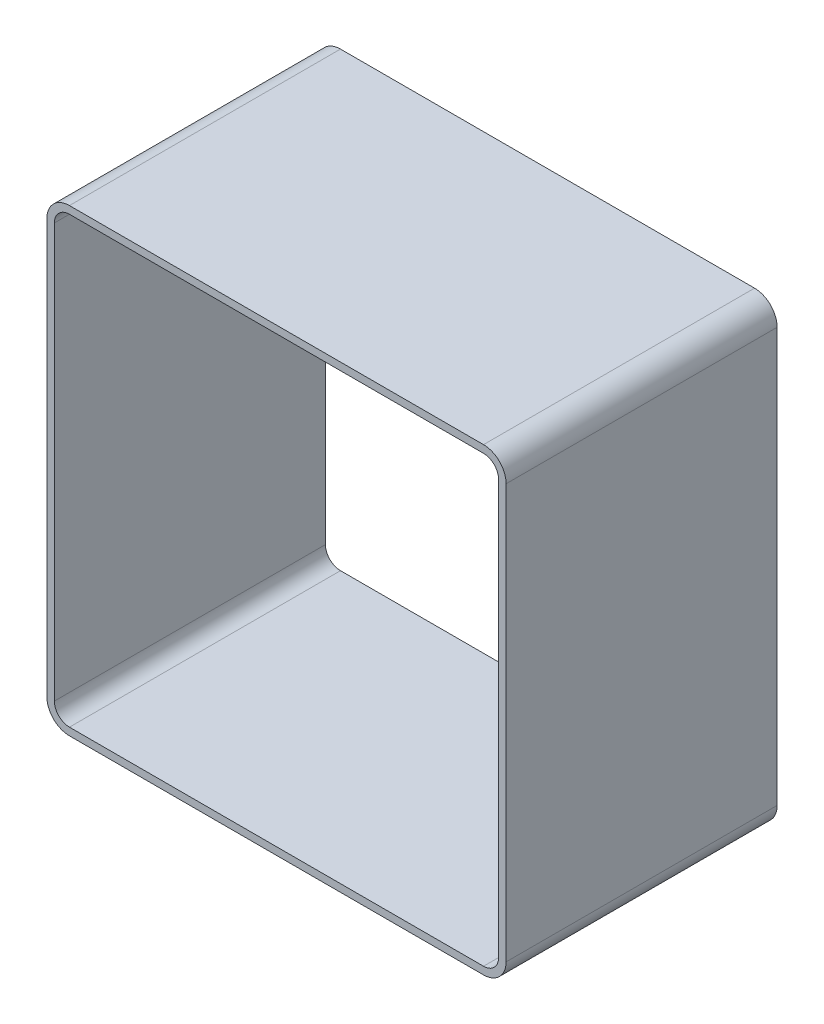
ISO-10303-21;
HEADER;
FILE_DESCRIPTION(('STEP AP214'),'2;1');
FILE_NAME('part.step','',(''),(''),'','','');
FILE_SCHEMA(('AUTOMOTIVE_DESIGN { 1 0 10303 214 1 1 1 1 }'));
ENDSEC;
DATA;
#1=APPLICATION_CONTEXT('core data for automotive mechanical design processes');
#2=APPLICATION_PROTOCOL_DEFINITION('international standard','automotive_design',2000,#1);
#3=PRODUCT_CONTEXT('',#1,'mechanical');
#4=PRODUCT('Part','Part','',(#3));
#5=PRODUCT_RELATED_PRODUCT_CATEGORY('part','',(#4));
#6=PRODUCT_DEFINITION_FORMATION('','',#4);
#7=PRODUCT_DEFINITION_CONTEXT('part definition',#1,'design');
#8=PRODUCT_DEFINITION('design','',#6,#7);
#9=PRODUCT_DEFINITION_SHAPE('','',#8);
#10=(LENGTH_UNIT() NAMED_UNIT(*) SI_UNIT(.MILLI.,.METRE.));
#11=(NAMED_UNIT(*) PLANE_ANGLE_UNIT() SI_UNIT($,.RADIAN.));
#12=(NAMED_UNIT(*) SI_UNIT($,.STERADIAN.) SOLID_ANGLE_UNIT());
#13=UNCERTAINTY_MEASURE_WITH_UNIT(LENGTH_MEASURE(1.E-05),#10,'distance_accuracy_value','');
#14=(GEOMETRIC_REPRESENTATION_CONTEXT(3) GLOBAL_UNCERTAINTY_ASSIGNED_CONTEXT((#13)) GLOBAL_UNIT_ASSIGNED_CONTEXT((#10,
#11,#12)) REPRESENTATION_CONTEXT('',''));
#15=CARTESIAN_POINT('',(0.,0.,0.));
#16=DIRECTION('',(0.,0.,1.));
#17=DIRECTION('',(1.,0.,0.));
#18=AXIS2_PLACEMENT_3D('',#15,#16,#17);
#19=CARTESIAN_POINT('',(-137.5,137.5,170.));
#20=DIRECTION('',(0.,0.,1.));
#21=DIRECTION('',(1.,0.,0.));
#22=AXIS2_PLACEMENT_3D('',#19,#20,#21);
#23=CYLINDRICAL_SURFACE('',#22,10.);
#24=DIRECTION('',(0.,0.,1.));
#25=VECTOR('',#24,1.);
#26=CARTESIAN_POINT('',(-137.5,147.5,0.));
#27=LINE('',#26,#25);
#28=CARTESIAN_POINT('',(-137.5,147.5,0.));
#29=VERTEX_POINT('',#28);
#30=CARTESIAN_POINT('',(-137.5,147.5,180.));
#31=VERTEX_POINT('',#30);
#32=EDGE_CURVE('E217',#29,#31,#27,.T.);
#33=ORIENTED_EDGE('',*,*,#32,.T.);
#34=CARTESIAN_POINT('',(-137.5,137.5,180.));
#35=DIRECTION('',(0.,0.,1.));
#36=DIRECTION('',(1.,0.,0.));
#37=AXIS2_PLACEMENT_3D('',#34,#35,#36);
#38=CIRCLE('',#37,10.);
#39=CARTESIAN_POINT('',(-147.5,137.5,180.));
#40=VERTEX_POINT('',#39);
#41=EDGE_CURVE('E162',#31,#40,#38,.T.);
#42=ORIENTED_EDGE('',*,*,#41,.T.);
#43=DIRECTION('',(0.,0.,1.));
#44=VECTOR('',#43,1.);
#45=CARTESIAN_POINT('',(-147.5,137.5,0.));
#46=LINE('',#45,#44);
#47=CARTESIAN_POINT('',(-147.5,137.5,0.));
#48=VERTEX_POINT('',#47);
#49=EDGE_CURVE('E156',#48,#40,#46,.T.);
#50=ORIENTED_EDGE('',*,*,#49,.F.);
#51=CARTESIAN_POINT('',(-137.5,137.5,0.));
#52=DIRECTION('',(0.,0.,1.));
#53=DIRECTION('',(1.,0.,0.));
#54=AXIS2_PLACEMENT_3D('',#51,#52,#53);
#55=CIRCLE('',#54,10.);
#56=EDGE_CURVE('E159',#29,#48,#55,.T.);
#57=ORIENTED_EDGE('',*,*,#56,.F.);
#58=EDGE_LOOP('',(#33,#42,#50,#57));
#59=FACE_BOUND('',#58,.T.);
#60=ADVANCED_FACE('F41',(#59),#23,.F.);
#61=CARTESIAN_POINT('',(-152.5,-152.5,180.));
#62=DIRECTION('',(1.,0.,0.));
#63=DIRECTION('',(0.,1.,0.));
#64=AXIS2_PLACEMENT_3D('',#61,#62,#63);
#65=PLANE('',#64);
#66=DIRECTION('',(0.,-1.,0.));
#67=VECTOR('',#66,1.);
#68=CARTESIAN_POINT('',(-152.5,-152.5,0.));
#69=LINE('',#68,#67);
#70=CARTESIAN_POINT('',(-152.5,137.5,0.));
#71=VERTEX_POINT('',#70);
#72=CARTESIAN_POINT('',(-152.5,-137.5,0.));
#73=VERTEX_POINT('',#72);
#74=EDGE_CURVE('E251',#71,#73,#69,.T.);
#75=ORIENTED_EDGE('',*,*,#74,.T.);
#76=DIRECTION('',(0.,0.,-1.));
#77=VECTOR('',#76,1.);
#78=CARTESIAN_POINT('',(-152.5,-137.5,180.));
#79=LINE('',#78,#77);
#80=CARTESIAN_POINT('',(-152.5,-137.5,180.));
#81=VERTEX_POINT('',#80);
#82=EDGE_CURVE('E11',#73,#81,#79,.F.);
#83=ORIENTED_EDGE('',*,*,#82,.T.);
#84=DIRECTION('',(0.,-1.,0.));
#85=VECTOR('',#84,1.);
#86=CARTESIAN_POINT('',(-152.5,-152.5,180.));
#87=LINE('',#86,#85);
#88=CARTESIAN_POINT('',(-152.5,137.5,180.));
#89=VERTEX_POINT('',#88);
#90=EDGE_CURVE('E252',#89,#81,#87,.T.);
#91=ORIENTED_EDGE('',*,*,#90,.F.);
#92=DIRECTION('',(0.,0.,-1.));
#93=VECTOR('',#92,1.);
#94=CARTESIAN_POINT('',(-152.5,137.5,180.));
#95=LINE('',#94,#93);
#96=EDGE_CURVE('E50',#89,#71,#95,.T.);
#97=ORIENTED_EDGE('',*,*,#96,.T.);
#98=EDGE_LOOP('',(#75,#83,#91,#97));
#99=FACE_BOUND('',#98,.T.);
#100=ADVANCED_FACE('F330',(#99),#65,.F.);
#101=CARTESIAN_POINT('',(-152.5,-152.5,180.));
#102=DIRECTION('',(0.,1.,0.));
#103=DIRECTION('',(0.,0.,1.));
#104=AXIS2_PLACEMENT_3D('',#101,#102,#103);
#105=PLANE('',#104);
#106=DIRECTION('',(1.,0.,0.));
#107=VECTOR('',#106,1.);
#108=CARTESIAN_POINT('',(-152.5,-152.5,0.));
#109=LINE('',#108,#107);
#110=CARTESIAN_POINT('',(-137.5,-152.5,0.));
#111=VERTEX_POINT('',#110);
#112=CARTESIAN_POINT('',(137.5,-152.5,0.));
#113=VERTEX_POINT('',#112);
#114=EDGE_CURVE('E272',#111,#113,#109,.T.);
#115=ORIENTED_EDGE('',*,*,#114,.T.);
#116=DIRECTION('',(0.,0.,-1.));
#117=VECTOR('',#116,1.);
#118=CARTESIAN_POINT('',(137.5,-152.5,180.));
#119=LINE('',#118,#117);
#120=CARTESIAN_POINT('',(137.5,-152.5,180.));
#121=VERTEX_POINT('',#120);
#122=EDGE_CURVE('E65',#113,#121,#119,.F.);
#123=ORIENTED_EDGE('',*,*,#122,.T.);
#124=DIRECTION('',(1.,0.,0.));
#125=VECTOR('',#124,1.);
#126=CARTESIAN_POINT('',(-152.5,-152.5,180.));
#127=LINE('',#126,#125);
#128=CARTESIAN_POINT('',(-137.5,-152.5,180.));
#129=VERTEX_POINT('',#128);
#130=EDGE_CURVE('E256',#129,#121,#127,.T.);
#131=ORIENTED_EDGE('',*,*,#130,.F.);
#132=DIRECTION('',(0.,0.,-1.));
#133=VECTOR('',#132,1.);
#134=CARTESIAN_POINT('',(-137.5,-152.5,180.));
#135=LINE('',#134,#133);
#136=EDGE_CURVE('E319',#129,#111,#135,.T.);
#137=ORIENTED_EDGE('',*,*,#136,.T.);
#138=EDGE_LOOP('',(#115,#123,#131,#137));
#139=FACE_BOUND('',#138,.T.);
#140=ADVANCED_FACE('F340',(#139),#105,.F.);
#141=CARTESIAN_POINT('',(152.5,-152.5,180.));
#142=DIRECTION('',(-1.,0.,0.));
#143=DIRECTION('',(0.,-1.,0.));
#144=AXIS2_PLACEMENT_3D('',#141,#142,#143);
#145=PLANE('',#144);
#146=DIRECTION('',(0.,1.,0.));
#147=VECTOR('',#146,1.);
#148=CARTESIAN_POINT('',(152.5,-152.5,0.));
#149=LINE('',#148,#147);
#150=CARTESIAN_POINT('',(152.5,-137.5,0.));
#151=VERTEX_POINT('',#150);
#152=CARTESIAN_POINT('',(152.5,137.5,0.));
#153=VERTEX_POINT('',#152);
#154=EDGE_CURVE('E275',#151,#153,#149,.T.);
#155=ORIENTED_EDGE('',*,*,#154,.T.);
#156=DIRECTION('',(0.,0.,-1.));
#157=VECTOR('',#156,1.);
#158=CARTESIAN_POINT('',(152.5,137.5,180.));
#159=LINE('',#158,#157);
#160=CARTESIAN_POINT('',(152.5,137.5,180.));
#161=VERTEX_POINT('',#160);
#162=EDGE_CURVE('E304',#153,#161,#159,.F.);
#163=ORIENTED_EDGE('',*,*,#162,.T.);
#164=DIRECTION('',(0.,1.,0.));
#165=VECTOR('',#164,1.);
#166=CARTESIAN_POINT('',(152.5,-152.5,180.));
#167=LINE('',#166,#165);
#168=CARTESIAN_POINT('',(152.5,-137.5,180.));
#169=VERTEX_POINT('',#168);
#170=EDGE_CURVE('E260',#169,#161,#167,.T.);
#171=ORIENTED_EDGE('',*,*,#170,.F.);
#172=DIRECTION('',(0.,0.,-1.));
#173=VECTOR('',#172,1.);
#174=CARTESIAN_POINT('',(152.5,-137.5,180.));
#175=LINE('',#174,#173);
#176=EDGE_CURVE('E300',#169,#151,#175,.T.);
#177=ORIENTED_EDGE('',*,*,#176,.T.);
#178=EDGE_LOOP('',(#155,#163,#171,#177));
#179=FACE_BOUND('',#178,.T.);
#180=ADVANCED_FACE('F350',(#179),#145,.F.);
#181=CARTESIAN_POINT('',(-152.5,152.5,180.));
#182=DIRECTION('',(0.,-1.,0.));
#183=DIRECTION('',(1.,0.,0.));
#184=AXIS2_PLACEMENT_3D('',#181,#182,#183);
#185=PLANE('',#184);
#186=DIRECTION('',(-1.,0.,0.));
#187=VECTOR('',#186,1.);
#188=CARTESIAN_POINT('',(-152.5,152.5,180.));
#189=LINE('',#188,#187);
#190=CARTESIAN_POINT('',(137.5,152.5,180.));
#191=VERTEX_POINT('',#190);
#192=CARTESIAN_POINT('',(-137.5,152.5,180.));
#193=VERTEX_POINT('',#192);
#194=EDGE_CURVE('E264',#191,#193,#189,.T.);
#195=ORIENTED_EDGE('',*,*,#194,.F.);
#196=DIRECTION('',(0.,0.,-1.));
#197=VECTOR('',#196,1.);
#198=CARTESIAN_POINT('',(137.5,152.5,180.));
#199=LINE('',#198,#197);
#200=CARTESIAN_POINT('',(137.5,152.5,0.));
#201=VERTEX_POINT('',#200);
#202=EDGE_CURVE('E284',#191,#201,#199,.T.);
#203=ORIENTED_EDGE('',*,*,#202,.T.);
#204=DIRECTION('',(-1.,0.,0.));
#205=VECTOR('',#204,1.);
#206=CARTESIAN_POINT('',(-152.5,152.5,0.));
#207=LINE('',#206,#205);
#208=CARTESIAN_POINT('',(-137.5,152.5,0.));
#209=VERTEX_POINT('',#208);
#210=EDGE_CURVE('E257',#201,#209,#207,.T.);
#211=ORIENTED_EDGE('',*,*,#210,.T.);
#212=DIRECTION('',(0.,0.,-1.));
#213=VECTOR('',#212,1.);
#214=CARTESIAN_POINT('',(-137.5,152.5,180.));
#215=LINE('',#214,#213);
#216=EDGE_CURVE('E268',#209,#193,#215,.F.);
#217=ORIENTED_EDGE('',*,*,#216,.T.);
#218=EDGE_LOOP('',(#195,#203,#211,#217));
#219=FACE_BOUND('',#218,.T.);
#220=ADVANCED_FACE('F358',(#219),#185,.F.);
#221=CARTESIAN_POINT('',(0.,0.,180.));
#222=DIRECTION('',(0.,0.,-1.));
#223=DIRECTION('',(-1.,0.,0.));
#224=AXIS2_PLACEMENT_3D('',#221,#222,#223);
#225=PLANE('',#224);
#226=ORIENTED_EDGE('',*,*,#41,.F.);
#227=DIRECTION('',(-1.,0.,0.));
#228=VECTOR('',#227,1.);
#229=CARTESIAN_POINT('',(-137.5,147.5,180.));
#230=LINE('',#229,#228);
#231=CARTESIAN_POINT('',(137.5,147.5,180.));
#232=VERTEX_POINT('',#231);
#233=EDGE_CURVE('E181',#232,#31,#230,.T.);
#234=ORIENTED_EDGE('',*,*,#233,.F.);
#235=CARTESIAN_POINT('',(137.5,137.5,180.));
#236=DIRECTION('',(0.,0.,1.));
#237=DIRECTION('',(1.,0.,0.));
#238=AXIS2_PLACEMENT_3D('',#235,#236,#237);
#239=CIRCLE('',#238,10.);
#240=CARTESIAN_POINT('',(147.5,137.5,180.));
#241=VERTEX_POINT('',#240);
#242=EDGE_CURVE('E241',#241,#232,#239,.T.);
#243=ORIENTED_EDGE('',*,*,#242,.F.);
#244=DIRECTION('',(0.,1.,0.));
#245=VECTOR('',#244,1.);
#246=CARTESIAN_POINT('',(147.5,137.5,180.));
#247=LINE('',#246,#245);
#248=CARTESIAN_POINT('',(147.5,-137.5,180.));
#249=VERTEX_POINT('',#248);
#250=EDGE_CURVE('E185',#249,#241,#247,.T.);
#251=ORIENTED_EDGE('',*,*,#250,.F.);
#252=CARTESIAN_POINT('',(137.5,-137.5,180.));
#253=DIRECTION('',(0.,0.,1.));
#254=DIRECTION('',(1.,0.,0.));
#255=AXIS2_PLACEMENT_3D('',#252,#253,#254);
#256=CIRCLE('',#255,10.);
#257=CARTESIAN_POINT('',(137.5,-147.5,180.));
#258=VERTEX_POINT('',#257);
#259=EDGE_CURVE('E237',#258,#249,#256,.T.);
#260=ORIENTED_EDGE('',*,*,#259,.F.);
#261=DIRECTION('',(1.,0.,0.));
#262=VECTOR('',#261,1.);
#263=CARTESIAN_POINT('',(-137.5,-147.5,180.));
#264=LINE('',#263,#262);
#265=CARTESIAN_POINT('',(-137.5,-147.5,180.));
#266=VERTEX_POINT('',#265);
#267=EDGE_CURVE('E210',#266,#258,#264,.T.);
#268=ORIENTED_EDGE('',*,*,#267,.F.);
#269=CARTESIAN_POINT('',(-137.5,-137.5,180.));
#270=DIRECTION('',(0.,0.,1.));
#271=DIRECTION('',(1.,0.,0.));
#272=AXIS2_PLACEMENT_3D('',#269,#270,#271);
#273=CIRCLE('',#272,10.);
#274=CARTESIAN_POINT('',(-147.5,-137.5,180.));
#275=VERTEX_POINT('',#274);
#276=EDGE_CURVE('E242',#275,#266,#273,.T.);
#277=ORIENTED_EDGE('',*,*,#276,.F.);
#278=DIRECTION('',(0.,-1.,0.));
#279=VECTOR('',#278,1.);
#280=CARTESIAN_POINT('',(-147.5,137.5,180.));
#281=LINE('',#280,#279);
#282=EDGE_CURVE('E207',#40,#275,#281,.T.);
#283=ORIENTED_EDGE('',*,*,#282,.F.);
#284=EDGE_LOOP('',(#226,#234,#243,#251,#260,#268,#277,#283));
#285=FACE_BOUND('',#284,.T.);
#286=ORIENTED_EDGE('',*,*,#170,.T.);
#287=CARTESIAN_POINT('',(137.5,137.5,180.));
#288=DIRECTION('',(0.,0.,-1.));
#289=DIRECTION('',(-1.,0.,0.));
#290=AXIS2_PLACEMENT_3D('',#287,#288,#289);
#291=CIRCLE('',#290,15.);
#292=EDGE_CURVE('E316',#161,#191,#291,.F.);
#293=ORIENTED_EDGE('',*,*,#292,.T.);
#294=ORIENTED_EDGE('',*,*,#194,.T.);
#295=CARTESIAN_POINT('',(-137.5,137.5,180.));
#296=DIRECTION('',(0.,0.,-1.));
#297=DIRECTION('',(-1.,0.,0.));
#298=AXIS2_PLACEMENT_3D('',#295,#296,#297);
#299=CIRCLE('',#298,15.);
#300=EDGE_CURVE('E307',#193,#89,#299,.F.);
#301=ORIENTED_EDGE('',*,*,#300,.T.);
#302=ORIENTED_EDGE('',*,*,#90,.T.);
#303=CARTESIAN_POINT('',(-137.5,-137.5,180.));
#304=DIRECTION('',(0.,0.,-1.));
#305=DIRECTION('',(-1.,0.,0.));
#306=AXIS2_PLACEMENT_3D('',#303,#304,#305);
#307=CIRCLE('',#306,15.);
#308=EDGE_CURVE('E310',#81,#129,#307,.F.);
#309=ORIENTED_EDGE('',*,*,#308,.T.);
#310=ORIENTED_EDGE('',*,*,#130,.T.);
#311=CARTESIAN_POINT('',(137.5,-137.5,180.));
#312=DIRECTION('',(0.,0.,-1.));
#313=DIRECTION('',(-1.,0.,0.));
#314=AXIS2_PLACEMENT_3D('',#311,#312,#313);
#315=CIRCLE('',#314,15.);
#316=EDGE_CURVE('E313',#121,#169,#315,.F.);
#317=ORIENTED_EDGE('',*,*,#316,.T.);
#318=EDGE_LOOP('',(#286,#293,#294,#301,#302,#309,#310,#317));
#319=FACE_BOUND('',#318,.T.);
#320=ADVANCED_FACE('F343',(#285,#319),#225,.F.);
#321=CARTESIAN_POINT('',(0.,0.,0.));
#322=DIRECTION('',(0.,0.,-1.));
#323=DIRECTION('',(-1.,0.,0.));
#324=AXIS2_PLACEMENT_3D('',#321,#322,#323);
#325=PLANE('',#324);
#326=ORIENTED_EDGE('',*,*,#56,.T.);
#327=DIRECTION('',(0.,-1.,0.));
#328=VECTOR('',#327,1.);
#329=CARTESIAN_POINT('',(-147.5,137.5,0.));
#330=LINE('',#329,#328);
#331=CARTESIAN_POINT('',(-147.5,-137.5,0.));
#332=VERTEX_POINT('',#331);
#333=EDGE_CURVE('E171',#48,#332,#330,.T.);
#334=ORIENTED_EDGE('',*,*,#333,.T.);
#335=CARTESIAN_POINT('',(-137.5,-137.5,0.));
#336=DIRECTION('',(0.,0.,1.));
#337=DIRECTION('',(1.,0.,0.));
#338=AXIS2_PLACEMENT_3D('',#335,#336,#337);
#339=CIRCLE('',#338,10.);
#340=CARTESIAN_POINT('',(-137.5,-147.5,0.));
#341=VERTEX_POINT('',#340);
#342=EDGE_CURVE('E57',#332,#341,#339,.T.);
#343=ORIENTED_EDGE('',*,*,#342,.T.);
#344=DIRECTION('',(1.,0.,0.));
#345=VECTOR('',#344,1.);
#346=CARTESIAN_POINT('',(-137.5,-147.5,0.));
#347=LINE('',#346,#345);
#348=CARTESIAN_POINT('',(137.5,-147.5,0.));
#349=VERTEX_POINT('',#348);
#350=EDGE_CURVE('E190',#341,#349,#347,.T.);
#351=ORIENTED_EDGE('',*,*,#350,.T.);
#352=CARTESIAN_POINT('',(137.5,-137.5,0.));
#353=DIRECTION('',(0.,0.,1.));
#354=DIRECTION('',(-1.,0.,0.));
#355=AXIS2_PLACEMENT_3D('',#352,#353,#354);
#356=CIRCLE('',#355,10.);
#357=CARTESIAN_POINT('',(147.5,-137.5,0.));
#358=VERTEX_POINT('',#357);
#359=EDGE_CURVE('E194',#349,#358,#356,.T.);
#360=ORIENTED_EDGE('',*,*,#359,.T.);
#361=DIRECTION('',(0.,1.,0.));
#362=VECTOR('',#361,1.);
#363=CARTESIAN_POINT('',(147.5,137.5,0.));
#364=LINE('',#363,#362);
#365=CARTESIAN_POINT('',(147.5,137.5,0.));
#366=VERTEX_POINT('',#365);
#367=EDGE_CURVE('E198',#358,#366,#364,.T.);
#368=ORIENTED_EDGE('',*,*,#367,.T.);
#369=CARTESIAN_POINT('',(137.5,137.5,0.));
#370=DIRECTION('',(0.,0.,1.));
#371=DIRECTION('',(1.,0.,0.));
#372=AXIS2_PLACEMENT_3D('',#369,#370,#371);
#373=CIRCLE('',#372,9.99999999999998);
#374=CARTESIAN_POINT('',(137.5,147.5,0.));
#375=VERTEX_POINT('',#374);
#376=EDGE_CURVE('E202',#366,#375,#373,.T.);
#377=ORIENTED_EDGE('',*,*,#376,.T.);
#378=DIRECTION('',(-1.,0.,0.));
#379=VECTOR('',#378,1.);
#380=CARTESIAN_POINT('',(-137.5,147.5,0.));
#381=LINE('',#380,#379);
#382=EDGE_CURVE('E168',#375,#29,#381,.T.);
#383=ORIENTED_EDGE('',*,*,#382,.T.);
#384=EDGE_LOOP('',(#326,#334,#343,#351,#360,#368,#377,#383));
#385=FACE_BOUND('',#384,.T.);
#386=ORIENTED_EDGE('',*,*,#210,.F.);
#387=CARTESIAN_POINT('',(137.5,137.5,0.));
#388=DIRECTION('',(0.,0.,-1.));
#389=DIRECTION('',(-1.,0.,0.));
#390=AXIS2_PLACEMENT_3D('',#387,#388,#389);
#391=CIRCLE('',#390,15.);
#392=EDGE_CURVE('E297',#201,#153,#391,.T.);
#393=ORIENTED_EDGE('',*,*,#392,.T.);
#394=ORIENTED_EDGE('',*,*,#154,.F.);
#395=CARTESIAN_POINT('',(137.5,-137.5,0.));
#396=DIRECTION('',(0.,0.,-1.));
#397=DIRECTION('',(-1.,0.,0.));
#398=AXIS2_PLACEMENT_3D('',#395,#396,#397);
#399=CIRCLE('',#398,15.);
#400=EDGE_CURVE('E294',#151,#113,#399,.T.);
#401=ORIENTED_EDGE('',*,*,#400,.T.);
#402=ORIENTED_EDGE('',*,*,#114,.F.);
#403=CARTESIAN_POINT('',(-137.5,-137.5,0.));
#404=DIRECTION('',(0.,0.,-1.));
#405=DIRECTION('',(-1.,0.,0.));
#406=AXIS2_PLACEMENT_3D('',#403,#404,#405);
#407=CIRCLE('',#406,15.);
#408=EDGE_CURVE('E291',#111,#73,#407,.T.);
#409=ORIENTED_EDGE('',*,*,#408,.T.);
#410=ORIENTED_EDGE('',*,*,#74,.F.);
#411=CARTESIAN_POINT('',(-137.5,137.5,0.));
#412=DIRECTION('',(0.,0.,-1.));
#413=DIRECTION('',(-1.,0.,0.));
#414=AXIS2_PLACEMENT_3D('',#411,#412,#413);
#415=CIRCLE('',#414,15.);
#416=EDGE_CURVE('E288',#71,#209,#415,.T.);
#417=ORIENTED_EDGE('',*,*,#416,.T.);
#418=EDGE_LOOP('',(#386,#393,#394,#401,#402,#409,#410,#417));
#419=FACE_BOUND('',#418,.T.);
#420=ADVANCED_FACE('F176',(#385,#419),#325,.T.);
#421=CARTESIAN_POINT('',(137.5,137.5,170.));
#422=DIRECTION('',(0.,0.,1.));
#423=DIRECTION('',(1.,0.,0.));
#424=AXIS2_PLACEMENT_3D('',#421,#422,#423);
#425=CYLINDRICAL_SURFACE('',#424,10.);
#426=ORIENTED_EDGE('',*,*,#242,.T.);
#427=DIRECTION('',(0.,0.,1.));
#428=VECTOR('',#427,1.);
#429=CARTESIAN_POINT('',(137.5,147.5,0.));
#430=LINE('',#429,#428);
#431=EDGE_CURVE('E220',#375,#232,#430,.T.);
#432=ORIENTED_EDGE('',*,*,#431,.F.);
#433=ORIENTED_EDGE('',*,*,#376,.F.);
#434=DIRECTION('',(0.,0.,1.));
#435=VECTOR('',#434,1.);
#436=CARTESIAN_POINT('',(147.5,137.5,0.));
#437=LINE('',#436,#435);
#438=EDGE_CURVE('E223',#366,#241,#437,.T.);
#439=ORIENTED_EDGE('',*,*,#438,.T.);
#440=EDGE_LOOP('',(#426,#432,#433,#439));
#441=FACE_BOUND('',#440,.T.);
#442=ADVANCED_FACE('F379',(#441),#425,.F.);
#443=CARTESIAN_POINT('',(137.5,-137.5,170.));
#444=DIRECTION('',(0.,0.,1.));
#445=DIRECTION('',(1.,0.,0.));
#446=AXIS2_PLACEMENT_3D('',#443,#444,#445);
#447=CYLINDRICAL_SURFACE('',#446,10.);
#448=ORIENTED_EDGE('',*,*,#259,.T.);
#449=DIRECTION('',(0.,0.,1.));
#450=VECTOR('',#449,1.);
#451=CARTESIAN_POINT('',(147.5,-137.5,0.));
#452=LINE('',#451,#450);
#453=EDGE_CURVE('E226',#358,#249,#452,.T.);
#454=ORIENTED_EDGE('',*,*,#453,.F.);
#455=ORIENTED_EDGE('',*,*,#359,.F.);
#456=DIRECTION('',(0.,0.,1.));
#457=VECTOR('',#456,1.);
#458=CARTESIAN_POINT('',(137.5,-147.5,0.));
#459=LINE('',#458,#457);
#460=EDGE_CURVE('E229',#349,#258,#459,.T.);
#461=ORIENTED_EDGE('',*,*,#460,.T.);
#462=EDGE_LOOP('',(#448,#454,#455,#461));
#463=FACE_BOUND('',#462,.T.);
#464=ADVANCED_FACE('F382',(#463),#447,.F.);
#465=CARTESIAN_POINT('',(-137.5,-137.5,170.));
#466=DIRECTION('',(0.,0.,1.));
#467=DIRECTION('',(1.,0.,0.));
#468=AXIS2_PLACEMENT_3D('',#465,#466,#467);
#469=CYLINDRICAL_SURFACE('',#468,10.);
#470=ORIENTED_EDGE('',*,*,#276,.T.);
#471=DIRECTION('',(0.,0.,1.));
#472=VECTOR('',#471,1.);
#473=CARTESIAN_POINT('',(-137.5,-147.5,0.));
#474=LINE('',#473,#472);
#475=EDGE_CURVE('E232',#341,#266,#474,.T.);
#476=ORIENTED_EDGE('',*,*,#475,.F.);
#477=ORIENTED_EDGE('',*,*,#342,.F.);
#478=DIRECTION('',(0.,0.,1.));
#479=VECTOR('',#478,1.);
#480=CARTESIAN_POINT('',(-147.5,-137.5,0.));
#481=LINE('',#480,#479);
#482=EDGE_CURVE('E167',#332,#275,#481,.T.);
#483=ORIENTED_EDGE('',*,*,#482,.T.);
#484=EDGE_LOOP('',(#470,#476,#477,#483));
#485=FACE_BOUND('',#484,.T.);
#486=ADVANCED_FACE('F377',(#485),#469,.F.);
#487=CARTESIAN_POINT('',(137.5,137.5,180.));
#488=DIRECTION('',(0.,0.,-1.));
#489=DIRECTION('',(-1.,0.,0.));
#490=AXIS2_PLACEMENT_3D('',#487,#488,#489);
#491=CYLINDRICAL_SURFACE('',#490,15.);
#492=ORIENTED_EDGE('',*,*,#292,.F.);
#493=ORIENTED_EDGE('',*,*,#162,.F.);
#494=ORIENTED_EDGE('',*,*,#392,.F.);
#495=ORIENTED_EDGE('',*,*,#202,.F.);
#496=EDGE_LOOP('',(#492,#493,#494,#495));
#497=FACE_BOUND('',#496,.T.);
#498=ADVANCED_FACE('F355',(#497),#491,.T.);
#499=CARTESIAN_POINT('',(137.5,-137.5,180.));
#500=DIRECTION('',(0.,0.,-1.));
#501=DIRECTION('',(-1.,0.,0.));
#502=AXIS2_PLACEMENT_3D('',#499,#500,#501);
#503=CYLINDRICAL_SURFACE('',#502,15.);
#504=ORIENTED_EDGE('',*,*,#316,.F.);
#505=ORIENTED_EDGE('',*,*,#122,.F.);
#506=ORIENTED_EDGE('',*,*,#400,.F.);
#507=ORIENTED_EDGE('',*,*,#176,.F.);
#508=EDGE_LOOP('',(#504,#505,#506,#507));
#509=FACE_BOUND('',#508,.T.);
#510=ADVANCED_FACE('F347',(#509),#503,.T.);
#511=CARTESIAN_POINT('',(-137.5,-137.5,180.));
#512=DIRECTION('',(0.,0.,-1.));
#513=DIRECTION('',(-1.,0.,0.));
#514=AXIS2_PLACEMENT_3D('',#511,#512,#513);
#515=CYLINDRICAL_SURFACE('',#514,15.);
#516=ORIENTED_EDGE('',*,*,#308,.F.);
#517=ORIENTED_EDGE('',*,*,#82,.F.);
#518=ORIENTED_EDGE('',*,*,#408,.F.);
#519=ORIENTED_EDGE('',*,*,#136,.F.);
#520=EDGE_LOOP('',(#516,#517,#518,#519));
#521=FACE_BOUND('',#520,.T.);
#522=ADVANCED_FACE('F339',(#521),#515,.T.);
#523=CARTESIAN_POINT('',(-137.5,137.5,180.));
#524=DIRECTION('',(0.,0.,-1.));
#525=DIRECTION('',(-1.,0.,0.));
#526=AXIS2_PLACEMENT_3D('',#523,#524,#525);
#527=CYLINDRICAL_SURFACE('',#526,15.);
#528=ORIENTED_EDGE('',*,*,#300,.F.);
#529=ORIENTED_EDGE('',*,*,#216,.F.);
#530=ORIENTED_EDGE('',*,*,#416,.F.);
#531=ORIENTED_EDGE('',*,*,#96,.F.);
#532=EDGE_LOOP('',(#528,#529,#530,#531));
#533=FACE_BOUND('',#532,.T.);
#534=ADVANCED_FACE('F43',(#533),#527,.T.);
#535=CARTESIAN_POINT('',(-137.5,147.5,0.));
#536=DIRECTION('',(0.,1.,0.));
#537=DIRECTION('',(-1.,0.,0.));
#538=AXIS2_PLACEMENT_3D('',#535,#536,#537);
#539=PLANE('',#538);
#540=ORIENTED_EDGE('',*,*,#233,.T.);
#541=ORIENTED_EDGE('',*,*,#32,.F.);
#542=ORIENTED_EDGE('',*,*,#382,.F.);
#543=ORIENTED_EDGE('',*,*,#431,.T.);
#544=EDGE_LOOP('',(#540,#541,#542,#543));
#545=FACE_BOUND('',#544,.T.);
#546=ADVANCED_FACE('F361',(#545),#539,.F.);
#547=CARTESIAN_POINT('',(147.5,137.5,0.));
#548=DIRECTION('',(1.,0.,0.));
#549=DIRECTION('',(0.,1.,0.));
#550=AXIS2_PLACEMENT_3D('',#547,#548,#549);
#551=PLANE('',#550);
#552=ORIENTED_EDGE('',*,*,#250,.T.);
#553=ORIENTED_EDGE('',*,*,#438,.F.);
#554=ORIENTED_EDGE('',*,*,#367,.F.);
#555=ORIENTED_EDGE('',*,*,#453,.T.);
#556=EDGE_LOOP('',(#552,#553,#554,#555));
#557=FACE_BOUND('',#556,.T.);
#558=ADVANCED_FACE('F366',(#557),#551,.F.);
#559=CARTESIAN_POINT('',(-137.5,-147.5,0.));
#560=DIRECTION('',(0.,-1.,0.));
#561=DIRECTION('',(0.,0.,-1.));
#562=AXIS2_PLACEMENT_3D('',#559,#560,#561);
#563=PLANE('',#562);
#564=ORIENTED_EDGE('',*,*,#267,.T.);
#565=ORIENTED_EDGE('',*,*,#460,.F.);
#566=ORIENTED_EDGE('',*,*,#350,.F.);
#567=ORIENTED_EDGE('',*,*,#475,.T.);
#568=EDGE_LOOP('',(#564,#565,#566,#567));
#569=FACE_BOUND('',#568,.T.);
#570=ADVANCED_FACE('F467',(#569),#563,.F.);
#571=CARTESIAN_POINT('',(-147.5,137.5,0.));
#572=DIRECTION('',(-1.,0.,0.));
#573=DIRECTION('',(0.,0.,1.));
#574=AXIS2_PLACEMENT_3D('',#571,#572,#573);
#575=PLANE('',#574);
#576=ORIENTED_EDGE('',*,*,#282,.T.);
#577=ORIENTED_EDGE('',*,*,#482,.F.);
#578=ORIENTED_EDGE('',*,*,#333,.F.);
#579=ORIENTED_EDGE('',*,*,#49,.T.);
#580=EDGE_LOOP('',(#576,#577,#578,#579));
#581=FACE_BOUND('',#580,.T.);
#582=ADVANCED_FACE('F172',(#581),#575,.F.);
#583=CLOSED_SHELL('',(#60,#100,#140,#180,#220,#320,#420,#442,#464,#486,#498,#510,#522,#534,#546,
#558,#570,#582));
#584=MANIFOLD_SOLID_BREP('B2',#583);
#585=ADVANCED_BREP_SHAPE_REPRESENTATION('',(#18,#584),#14);
#586=SHAPE_DEFINITION_REPRESENTATION(#9,#585);
ENDSEC;
END-ISO-10303-21;
